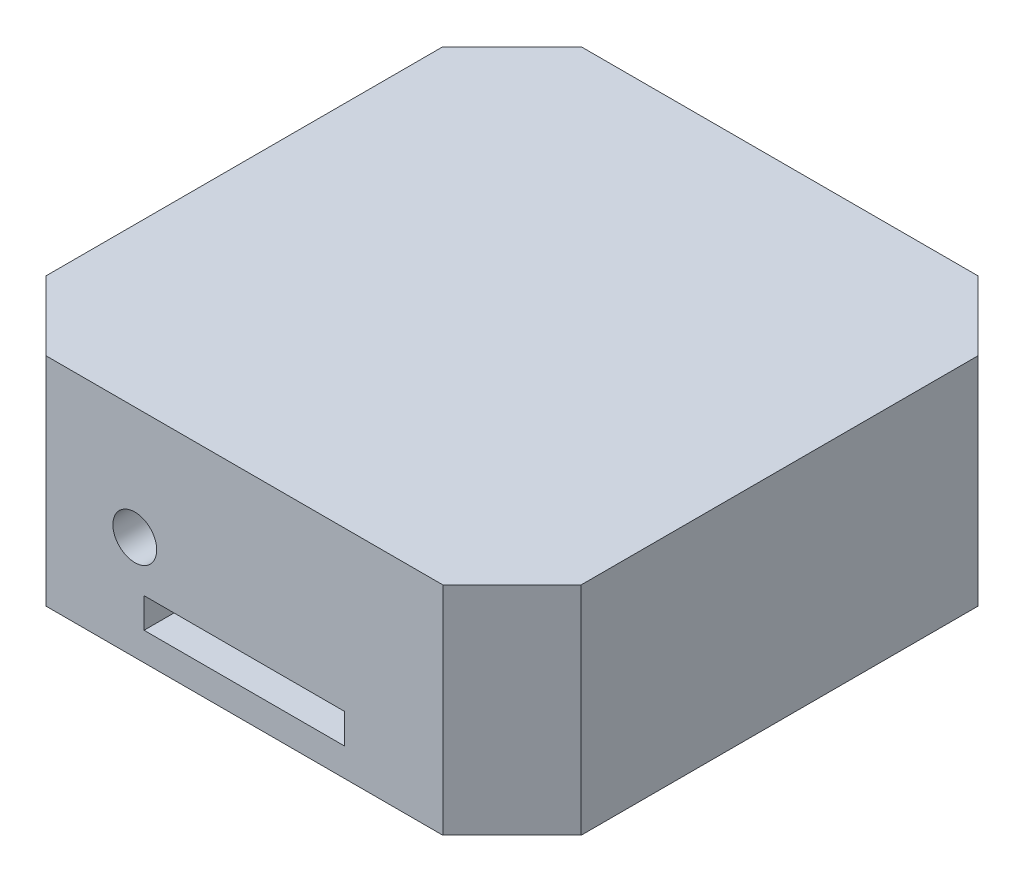
ISO-10303-21;
HEADER;
FILE_DESCRIPTION(('STEP AP214'),'2;1');
FILE_NAME('part.step','',(''),(''),'','','');
FILE_SCHEMA(('AUTOMOTIVE_DESIGN { 1 0 10303 214 1 1 1 1 }'));
ENDSEC;
DATA;
#1=APPLICATION_CONTEXT('core data for automotive mechanical design processes');
#2=APPLICATION_PROTOCOL_DEFINITION('international standard','automotive_design',2000,#1);
#3=PRODUCT_CONTEXT('',#1,'mechanical');
#4=PRODUCT('Part','Part','',(#3));
#5=PRODUCT_RELATED_PRODUCT_CATEGORY('part','',(#4));
#6=PRODUCT_DEFINITION_FORMATION('','',#4);
#7=PRODUCT_DEFINITION_CONTEXT('part definition',#1,'design');
#8=PRODUCT_DEFINITION('design','',#6,#7);
#9=PRODUCT_DEFINITION_SHAPE('','',#8);
#10=(LENGTH_UNIT() NAMED_UNIT(*) SI_UNIT(.MILLI.,.METRE.));
#11=(NAMED_UNIT(*) PLANE_ANGLE_UNIT() SI_UNIT($,.RADIAN.));
#12=(NAMED_UNIT(*) SI_UNIT($,.STERADIAN.) SOLID_ANGLE_UNIT());
#13=UNCERTAINTY_MEASURE_WITH_UNIT(LENGTH_MEASURE(1.E-05),#10,'distance_accuracy_value','');
#14=(GEOMETRIC_REPRESENTATION_CONTEXT(3) GLOBAL_UNCERTAINTY_ASSIGNED_CONTEXT((#13)) GLOBAL_UNIT_ASSIGNED_CONTEXT((#10,
#11,#12)) REPRESENTATION_CONTEXT('',''));
#15=CARTESIAN_POINT('',(0.,0.,0.));
#16=DIRECTION('',(0.,0.,1.));
#17=DIRECTION('',(1.,0.,0.));
#18=AXIS2_PLACEMENT_3D('',#15,#16,#17);
#19=CARTESIAN_POINT('',(-58.,47.,-43.));
#20=DIRECTION('',(0.707106781186547,0.,0.707106781186547));
#21=DIRECTION('',(0.707106781186548,0.,-0.707106781186548));
#22=AXIS2_PLACEMENT_3D('',#19,#20,#21);
#23=PLANE('',#22);
#24=DIRECTION('',(-0.707106781186548,0.,0.707106781186548));
#25=VECTOR('',#24,1.);
#26=CARTESIAN_POINT('',(-58.,0.,-43.));
#27=LINE('',#26,#25);
#28=CARTESIAN_POINT('',(-43.,0.,-58.));
#29=VERTEX_POINT('',#28);
#30=CARTESIAN_POINT('',(-58.,0.,-43.));
#31=VERTEX_POINT('',#30);
#32=EDGE_CURVE('E141',#29,#31,#27,.T.);
#33=ORIENTED_EDGE('',*,*,#32,.T.);
#34=DIRECTION('',(0.,-1.,0.));
#35=VECTOR('',#34,1.);
#36=CARTESIAN_POINT('',(-58.,47.,-43.));
#37=LINE('',#36,#35);
#38=CARTESIAN_POINT('',(-58.,47.,-43.));
#39=VERTEX_POINT('',#38);
#40=EDGE_CURVE('E11',#39,#31,#37,.T.);
#41=ORIENTED_EDGE('',*,*,#40,.F.);
#42=DIRECTION('',(-0.707106781186548,0.,0.707106781186548));
#43=VECTOR('',#42,1.);
#44=CARTESIAN_POINT('',(-58.,47.,-43.));
#45=LINE('',#44,#43);
#46=CARTESIAN_POINT('',(-43.,47.,-58.));
#47=VERTEX_POINT('',#46);
#48=EDGE_CURVE('E157',#47,#39,#45,.T.);
#49=ORIENTED_EDGE('',*,*,#48,.F.);
#50=DIRECTION('',(0.,-1.,0.));
#51=VECTOR('',#50,1.);
#52=CARTESIAN_POINT('',(-43.,47.,-58.));
#53=LINE('',#52,#51);
#54=EDGE_CURVE('E137',#47,#29,#53,.T.);
#55=ORIENTED_EDGE('',*,*,#54,.T.);
#56=EDGE_LOOP('',(#33,#41,#49,#55));
#57=FACE_BOUND('',#56,.T.);
#58=ADVANCED_FACE('F33',(#57),#23,.F.);
#59=CARTESIAN_POINT('',(-58.,47.,43.));
#60=DIRECTION('',(1.,0.,0.));
#61=DIRECTION('',(0.,0.,-1.));
#62=AXIS2_PLACEMENT_3D('',#59,#60,#61);
#63=PLANE('',#62);
#64=DIRECTION('',(0.,0.,1.));
#65=VECTOR('',#64,1.);
#66=CARTESIAN_POINT('',(-58.,0.,43.));
#67=LINE('',#66,#65);
#68=CARTESIAN_POINT('',(-58.,0.,43.));
#69=VERTEX_POINT('',#68);
#70=EDGE_CURVE('E144',#31,#69,#67,.T.);
#71=ORIENTED_EDGE('',*,*,#70,.T.);
#72=DIRECTION('',(0.,-1.,0.));
#73=VECTOR('',#72,1.);
#74=CARTESIAN_POINT('',(-58.,47.,43.));
#75=LINE('',#74,#73);
#76=CARTESIAN_POINT('',(-58.,47.,43.));
#77=VERTEX_POINT('',#76);
#78=EDGE_CURVE('E40',#77,#69,#75,.T.);
#79=ORIENTED_EDGE('',*,*,#78,.F.);
#80=DIRECTION('',(0.,0.,1.));
#81=VECTOR('',#80,1.);
#82=CARTESIAN_POINT('',(-58.,47.,43.));
#83=LINE('',#82,#81);
#84=EDGE_CURVE('E97',#39,#77,#83,.T.);
#85=ORIENTED_EDGE('',*,*,#84,.F.);
#86=ORIENTED_EDGE('',*,*,#40,.T.);
#87=EDGE_LOOP('',(#71,#79,#85,#86));
#88=FACE_BOUND('',#87,.T.);
#89=ADVANCED_FACE('F267',(#88),#63,.F.);
#90=CARTESIAN_POINT('',(-43.,47.,58.));
#91=DIRECTION('',(0.707106781186547,0.,-0.707106781186548));
#92=DIRECTION('',(-0.707106781186548,0.,-0.707106781186547));
#93=AXIS2_PLACEMENT_3D('',#90,#91,#92);
#94=PLANE('',#93);
#95=DIRECTION('',(0.707106781186548,0.,0.707106781186547));
#96=VECTOR('',#95,1.);
#97=CARTESIAN_POINT('',(-43.,0.,58.));
#98=LINE('',#97,#96);
#99=CARTESIAN_POINT('',(-43.,0.,58.));
#100=VERTEX_POINT('',#99);
#101=EDGE_CURVE('E147',#69,#100,#98,.T.);
#102=ORIENTED_EDGE('',*,*,#101,.T.);
#103=DIRECTION('',(0.,-1.,0.));
#104=VECTOR('',#103,1.);
#105=CARTESIAN_POINT('',(-43.,47.,58.));
#106=LINE('',#105,#104);
#107=CARTESIAN_POINT('',(-43.,47.,58.));
#108=VERTEX_POINT('',#107);
#109=EDGE_CURVE('E164',#108,#100,#106,.T.);
#110=ORIENTED_EDGE('',*,*,#109,.F.);
#111=DIRECTION('',(0.707106781186548,0.,0.707106781186547));
#112=VECTOR('',#111,1.);
#113=CARTESIAN_POINT('',(-43.,47.,58.));
#114=LINE('',#113,#112);
#115=EDGE_CURVE('E172',#77,#108,#114,.T.);
#116=ORIENTED_EDGE('',*,*,#115,.F.);
#117=ORIENTED_EDGE('',*,*,#78,.T.);
#118=EDGE_LOOP('',(#102,#110,#116,#117));
#119=FACE_BOUND('',#118,.T.);
#120=ADVANCED_FACE('F170',(#119),#94,.F.);
#121=CARTESIAN_POINT('',(43.,47.,58.));
#122=DIRECTION('',(0.,0.,-1.));
#123=DIRECTION('',(-1.,0.,0.));
#124=AXIS2_PLACEMENT_3D('',#121,#122,#123);
#125=PLANE('',#124);
#126=DIRECTION('',(-1.,0.,0.));
#127=VECTOR('',#126,1.);
#128=CARTESIAN_POINT('',(-21.75,12.6,58.));
#129=LINE('',#128,#127);
#130=CARTESIAN_POINT('',(21.75,12.6,58.));
#131=VERTEX_POINT('',#130);
#132=CARTESIAN_POINT('',(-21.75,12.6,58.));
#133=VERTEX_POINT('',#132);
#134=EDGE_CURVE('E213',#131,#133,#129,.T.);
#135=ORIENTED_EDGE('',*,*,#134,.F.);
#136=DIRECTION('',(0.,1.,0.));
#137=VECTOR('',#136,1.);
#138=CARTESIAN_POINT('',(21.75,12.6,58.));
#139=LINE('',#138,#137);
#140=CARTESIAN_POINT('',(21.75,6.1,58.));
#141=VERTEX_POINT('',#140);
#142=EDGE_CURVE('E47',#141,#131,#139,.T.);
#143=ORIENTED_EDGE('',*,*,#142,.F.);
#144=DIRECTION('',(1.,0.,0.));
#145=VECTOR('',#144,1.);
#146=CARTESIAN_POINT('',(-21.75,6.1,58.));
#147=LINE('',#146,#145);
#148=CARTESIAN_POINT('',(-21.75,6.1,58.));
#149=VERTEX_POINT('',#148);
#150=EDGE_CURVE('E206',#149,#141,#147,.T.);
#151=ORIENTED_EDGE('',*,*,#150,.F.);
#152=DIRECTION('',(0.,-1.,0.));
#153=VECTOR('',#152,1.);
#154=CARTESIAN_POINT('',(-21.75,12.6,58.));
#155=LINE('',#154,#153);
#156=EDGE_CURVE('E210',#133,#149,#155,.T.);
#157=ORIENTED_EDGE('',*,*,#156,.F.);
#158=EDGE_LOOP('',(#135,#143,#151,#157));
#159=FACE_BOUND('',#158,.T.);
#160=CARTESIAN_POINT('',(-23.75,22.55,58.));
#161=DIRECTION('',(0.,0.,1.));
#162=DIRECTION('',(1.,0.,0.));
#163=AXIS2_PLACEMENT_3D('',#160,#161,#162);
#164=CIRCLE('',#163,4.75);
#165=CARTESIAN_POINT('',(-19.,22.55,58.));
#166=VERTEX_POINT('',#165);
#167=EDGE_CURVE('E190',#166,#166,#164,.T.);
#168=ORIENTED_EDGE('',*,*,#167,.F.);
#169=EDGE_LOOP('',(#168));
#170=FACE_BOUND('',#169,.T.);
#171=DIRECTION('',(1.,0.,0.));
#172=VECTOR('',#171,1.);
#173=CARTESIAN_POINT('',(43.,0.,58.));
#174=LINE('',#173,#172);
#175=CARTESIAN_POINT('',(43.,0.,58.));
#176=VERTEX_POINT('',#175);
#177=EDGE_CURVE('E149',#100,#176,#174,.T.);
#178=ORIENTED_EDGE('',*,*,#177,.T.);
#179=DIRECTION('',(0.,-1.,0.));
#180=VECTOR('',#179,1.);
#181=CARTESIAN_POINT('',(43.,47.,58.));
#182=LINE('',#181,#180);
#183=CARTESIAN_POINT('',(43.,47.,58.));
#184=VERTEX_POINT('',#183);
#185=EDGE_CURVE('E161',#184,#176,#182,.T.);
#186=ORIENTED_EDGE('',*,*,#185,.F.);
#187=DIRECTION('',(1.,0.,0.));
#188=VECTOR('',#187,1.);
#189=CARTESIAN_POINT('',(43.,47.,58.));
#190=LINE('',#189,#188);
#191=EDGE_CURVE('E184',#108,#184,#190,.T.);
#192=ORIENTED_EDGE('',*,*,#191,.F.);
#193=ORIENTED_EDGE('',*,*,#109,.T.);
#194=EDGE_LOOP('',(#178,#186,#192,#193));
#195=FACE_BOUND('',#194,.T.);
#196=ADVANCED_FACE('F180',(#159,#170,#195),#125,.F.);
#197=CARTESIAN_POINT('',(58.,47.,43.));
#198=DIRECTION('',(-0.707106781186547,0.,-0.707106781186547));
#199=DIRECTION('',(-0.707106781186548,0.,0.707106781186548));
#200=AXIS2_PLACEMENT_3D('',#197,#198,#199);
#201=PLANE('',#200);
#202=DIRECTION('',(0.707106781186548,0.,-0.707106781186548));
#203=VECTOR('',#202,1.);
#204=CARTESIAN_POINT('',(58.,0.,43.));
#205=LINE('',#204,#203);
#206=CARTESIAN_POINT('',(58.,0.,43.));
#207=VERTEX_POINT('',#206);
#208=EDGE_CURVE('E151',#176,#207,#205,.T.);
#209=ORIENTED_EDGE('',*,*,#208,.T.);
#210=DIRECTION('',(0.,-1.,0.));
#211=VECTOR('',#210,1.);
#212=CARTESIAN_POINT('',(58.,47.,43.));
#213=LINE('',#212,#211);
#214=CARTESIAN_POINT('',(58.,47.,43.));
#215=VERTEX_POINT('',#214);
#216=EDGE_CURVE('E132',#215,#207,#213,.T.);
#217=ORIENTED_EDGE('',*,*,#216,.F.);
#218=DIRECTION('',(0.707106781186548,0.,-0.707106781186548));
#219=VECTOR('',#218,1.);
#220=CARTESIAN_POINT('',(58.,47.,43.));
#221=LINE('',#220,#219);
#222=EDGE_CURVE('E120',#184,#215,#221,.T.);
#223=ORIENTED_EDGE('',*,*,#222,.F.);
#224=ORIENTED_EDGE('',*,*,#185,.T.);
#225=EDGE_LOOP('',(#209,#217,#223,#224));
#226=FACE_BOUND('',#225,.T.);
#227=ADVANCED_FACE('F183',(#226),#201,.F.);
#228=CARTESIAN_POINT('',(58.,47.,-43.));
#229=DIRECTION('',(-1.,0.,0.));
#230=DIRECTION('',(0.,0.,1.));
#231=AXIS2_PLACEMENT_3D('',#228,#229,#230);
#232=PLANE('',#231);
#233=DIRECTION('',(0.,0.,-1.));
#234=VECTOR('',#233,1.);
#235=CARTESIAN_POINT('',(58.,0.,-43.));
#236=LINE('',#235,#234);
#237=CARTESIAN_POINT('',(58.,0.,-43.));
#238=VERTEX_POINT('',#237);
#239=EDGE_CURVE('E129',#207,#238,#236,.T.);
#240=ORIENTED_EDGE('',*,*,#239,.T.);
#241=DIRECTION('',(0.,-1.,0.));
#242=VECTOR('',#241,1.);
#243=CARTESIAN_POINT('',(58.,47.,-43.));
#244=LINE('',#243,#242);
#245=CARTESIAN_POINT('',(58.,47.,-43.));
#246=VERTEX_POINT('',#245);
#247=EDGE_CURVE('E126',#246,#238,#244,.T.);
#248=ORIENTED_EDGE('',*,*,#247,.F.);
#249=DIRECTION('',(0.,0.,-1.));
#250=VECTOR('',#249,1.);
#251=CARTESIAN_POINT('',(58.,47.,-43.));
#252=LINE('',#251,#250);
#253=EDGE_CURVE('E113',#215,#246,#252,.T.);
#254=ORIENTED_EDGE('',*,*,#253,.F.);
#255=ORIENTED_EDGE('',*,*,#216,.T.);
#256=EDGE_LOOP('',(#240,#248,#254,#255));
#257=FACE_BOUND('',#256,.T.);
#258=ADVANCED_FACE('F127',(#257),#232,.F.);
#259=CARTESIAN_POINT('',(43.,47.,-58.));
#260=DIRECTION('',(-0.707106781186548,0.,0.707106781186547));
#261=DIRECTION('',(0.707106781186547,0.,0.707106781186548));
#262=AXIS2_PLACEMENT_3D('',#259,#260,#261);
#263=PLANE('',#262);
#264=DIRECTION('',(-0.707106781186547,0.,-0.707106781186548));
#265=VECTOR('',#264,1.);
#266=CARTESIAN_POINT('',(43.,0.,-58.));
#267=LINE('',#266,#265);
#268=CARTESIAN_POINT('',(43.,0.,-58.));
#269=VERTEX_POINT('',#268);
#270=EDGE_CURVE('E154',#238,#269,#267,.T.);
#271=ORIENTED_EDGE('',*,*,#270,.T.);
#272=DIRECTION('',(0.,-1.,0.));
#273=VECTOR('',#272,1.);
#274=CARTESIAN_POINT('',(43.,47.,-58.));
#275=LINE('',#274,#273);
#276=CARTESIAN_POINT('',(43.,47.,-58.));
#277=VERTEX_POINT('',#276);
#278=EDGE_CURVE('E133',#277,#269,#275,.T.);
#279=ORIENTED_EDGE('',*,*,#278,.F.);
#280=DIRECTION('',(-0.707106781186547,0.,-0.707106781186548));
#281=VECTOR('',#280,1.);
#282=CARTESIAN_POINT('',(43.,47.,-58.));
#283=LINE('',#282,#281);
#284=EDGE_CURVE('E117',#246,#277,#283,.T.);
#285=ORIENTED_EDGE('',*,*,#284,.F.);
#286=ORIENTED_EDGE('',*,*,#247,.T.);
#287=EDGE_LOOP('',(#271,#279,#285,#286));
#288=FACE_BOUND('',#287,.T.);
#289=ADVANCED_FACE('F135',(#288),#263,.F.);
#290=CARTESIAN_POINT('',(-43.,47.,-58.));
#291=DIRECTION('',(0.,0.,1.));
#292=DIRECTION('',(1.,0.,0.));
#293=AXIS2_PLACEMENT_3D('',#290,#291,#292);
#294=PLANE('',#293);
#295=DIRECTION('',(-1.,0.,0.));
#296=VECTOR('',#295,1.);
#297=CARTESIAN_POINT('',(-43.,0.,-58.));
#298=LINE('',#297,#296);
#299=EDGE_CURVE('E89',#269,#29,#298,.T.);
#300=ORIENTED_EDGE('',*,*,#299,.T.);
#301=ORIENTED_EDGE('',*,*,#54,.F.);
#302=DIRECTION('',(-1.,0.,0.));
#303=VECTOR('',#302,1.);
#304=CARTESIAN_POINT('',(-43.,47.,-58.));
#305=LINE('',#304,#303);
#306=EDGE_CURVE('E56',#277,#47,#305,.T.);
#307=ORIENTED_EDGE('',*,*,#306,.F.);
#308=ORIENTED_EDGE('',*,*,#278,.T.);
#309=EDGE_LOOP('',(#300,#301,#307,#308));
#310=FACE_BOUND('',#309,.T.);
#311=ADVANCED_FACE('F274',(#310),#294,.F.);
#312=CARTESIAN_POINT('',(0.,47.,0.));
#313=DIRECTION('',(0.,-1.,0.));
#314=DIRECTION('',(0.,0.,-1.));
#315=AXIS2_PLACEMENT_3D('',#312,#313,#314);
#316=PLANE('',#315);
#317=ORIENTED_EDGE('',*,*,#48,.T.);
#318=ORIENTED_EDGE('',*,*,#84,.T.);
#319=ORIENTED_EDGE('',*,*,#115,.T.);
#320=ORIENTED_EDGE('',*,*,#191,.T.);
#321=ORIENTED_EDGE('',*,*,#222,.T.);
#322=ORIENTED_EDGE('',*,*,#253,.T.);
#323=ORIENTED_EDGE('',*,*,#284,.T.);
#324=ORIENTED_EDGE('',*,*,#306,.T.);
#325=EDGE_LOOP('',(#317,#318,#319,#320,#321,#322,#323,#324));
#326=FACE_BOUND('',#325,.T.);
#327=ADVANCED_FACE('F115',(#326),#316,.F.);
#328=CARTESIAN_POINT('',(0.,0.,0.));
#329=DIRECTION('',(0.,-1.,0.));
#330=DIRECTION('',(0.,0.,-1.));
#331=AXIS2_PLACEMENT_3D('',#328,#329,#330);
#332=PLANE('',#331);
#333=ORIENTED_EDGE('',*,*,#32,.F.);
#334=ORIENTED_EDGE('',*,*,#299,.F.);
#335=ORIENTED_EDGE('',*,*,#270,.F.);
#336=ORIENTED_EDGE('',*,*,#239,.F.);
#337=ORIENTED_EDGE('',*,*,#208,.F.);
#338=ORIENTED_EDGE('',*,*,#177,.F.);
#339=ORIENTED_EDGE('',*,*,#101,.F.);
#340=ORIENTED_EDGE('',*,*,#70,.F.);
#341=EDGE_LOOP('',(#333,#334,#335,#336,#337,#338,#339,#340));
#342=FACE_BOUND('',#341,.T.);
#343=ADVANCED_FACE('F176',(#342),#332,.T.);
#344=CARTESIAN_POINT('',(-23.75,22.55,48.));
#345=DIRECTION('',(0.,0.,1.));
#346=DIRECTION('',(1.,0.,0.));
#347=AXIS2_PLACEMENT_3D('',#344,#345,#346);
#348=CYLINDRICAL_SURFACE('',#347,4.75);
#349=CARTESIAN_POINT('',(-23.75,22.55,48.));
#350=DIRECTION('',(0.,0.,1.));
#351=DIRECTION('',(1.,0.,0.));
#352=AXIS2_PLACEMENT_3D('',#349,#350,#351);
#353=CIRCLE('',#352,4.75);
#354=CARTESIAN_POINT('',(-19.,22.55,48.));
#355=VERTEX_POINT('',#354);
#356=EDGE_CURVE('E193',#355,#355,#353,.T.);
#357=ORIENTED_EDGE('',*,*,#356,.F.);
#358=EDGE_LOOP('',(#357));
#359=FACE_BOUND('',#358,.T.);
#360=ORIENTED_EDGE('',*,*,#167,.T.);
#361=EDGE_LOOP('',(#360));
#362=FACE_BOUND('',#361,.T.);
#363=ADVANCED_FACE('F331',(#359,#362),#348,.F.);
#364=CARTESIAN_POINT('',(-23.75,22.55,48.));
#365=DIRECTION('',(0.,0.,1.));
#366=DIRECTION('',(1.,0.,0.));
#367=AXIS2_PLACEMENT_3D('',#364,#365,#366);
#368=PLANE('',#367);
#369=ORIENTED_EDGE('',*,*,#356,.T.);
#370=EDGE_LOOP('',(#369));
#371=FACE_BOUND('',#370,.T.);
#372=ADVANCED_FACE('F339',(#371),#368,.T.);
#373=CARTESIAN_POINT('',(21.75,12.6,48.));
#374=DIRECTION('',(1.,0.,0.));
#375=DIRECTION('',(0.,0.,-1.));
#376=AXIS2_PLACEMENT_3D('',#373,#374,#375);
#377=PLANE('',#376);
#378=ORIENTED_EDGE('',*,*,#142,.T.);
#379=DIRECTION('',(0.,0.,1.));
#380=VECTOR('',#379,1.);
#381=CARTESIAN_POINT('',(21.75,12.6,48.));
#382=LINE('',#381,#380);
#383=CARTESIAN_POINT('',(21.75,12.6,48.));
#384=VERTEX_POINT('',#383);
#385=EDGE_CURVE('E196',#384,#131,#382,.T.);
#386=ORIENTED_EDGE('',*,*,#385,.F.);
#387=DIRECTION('',(0.,1.,0.));
#388=VECTOR('',#387,1.);
#389=CARTESIAN_POINT('',(21.75,12.6,48.));
#390=LINE('',#389,#388);
#391=CARTESIAN_POINT('',(21.75,6.1,48.));
#392=VERTEX_POINT('',#391);
#393=EDGE_CURVE('E209',#392,#384,#390,.T.);
#394=ORIENTED_EDGE('',*,*,#393,.F.);
#395=DIRECTION('',(0.,0.,1.));
#396=VECTOR('',#395,1.);
#397=CARTESIAN_POINT('',(21.75,6.1,48.));
#398=LINE('',#397,#396);
#399=EDGE_CURVE('E145',#392,#141,#398,.T.);
#400=ORIENTED_EDGE('',*,*,#399,.T.);
#401=EDGE_LOOP('',(#378,#386,#394,#400));
#402=FACE_BOUND('',#401,.T.);
#403=ADVANCED_FACE('F234',(#402),#377,.F.);
#404=CARTESIAN_POINT('',(-21.75,6.1,48.));
#405=DIRECTION('',(0.,-1.,0.));
#406=DIRECTION('',(0.,0.,-1.));
#407=AXIS2_PLACEMENT_3D('',#404,#405,#406);
#408=PLANE('',#407);
#409=ORIENTED_EDGE('',*,*,#150,.T.);
#410=ORIENTED_EDGE('',*,*,#399,.F.);
#411=DIRECTION('',(1.,0.,0.));
#412=VECTOR('',#411,1.);
#413=CARTESIAN_POINT('',(-21.75,6.1,48.));
#414=LINE('',#413,#412);
#415=CARTESIAN_POINT('',(-21.75,6.1,48.));
#416=VERTEX_POINT('',#415);
#417=EDGE_CURVE('E199',#416,#392,#414,.T.);
#418=ORIENTED_EDGE('',*,*,#417,.F.);
#419=DIRECTION('',(0.,0.,1.));
#420=VECTOR('',#419,1.);
#421=CARTESIAN_POINT('',(-21.75,6.1,48.));
#422=LINE('',#421,#420);
#423=EDGE_CURVE('E202',#416,#149,#422,.T.);
#424=ORIENTED_EDGE('',*,*,#423,.T.);
#425=EDGE_LOOP('',(#409,#410,#418,#424));
#426=FACE_BOUND('',#425,.T.);
#427=ADVANCED_FACE('F245',(#426),#408,.F.);
#428=CARTESIAN_POINT('',(-21.75,12.6,48.));
#429=DIRECTION('',(-1.,0.,0.));
#430=DIRECTION('',(0.,0.,1.));
#431=AXIS2_PLACEMENT_3D('',#428,#429,#430);
#432=PLANE('',#431);
#433=ORIENTED_EDGE('',*,*,#156,.T.);
#434=ORIENTED_EDGE('',*,*,#423,.F.);
#435=DIRECTION('',(0.,-1.,0.));
#436=VECTOR('',#435,1.);
#437=CARTESIAN_POINT('',(-21.75,12.6,48.));
#438=LINE('',#437,#436);
#439=CARTESIAN_POINT('',(-21.75,12.6,48.));
#440=VERTEX_POINT('',#439);
#441=EDGE_CURVE('E219',#440,#416,#438,.T.);
#442=ORIENTED_EDGE('',*,*,#441,.F.);
#443=DIRECTION('',(0.,0.,1.));
#444=VECTOR('',#443,1.);
#445=CARTESIAN_POINT('',(-21.75,12.6,48.));
#446=LINE('',#445,#444);
#447=EDGE_CURVE('E198',#440,#133,#446,.T.);
#448=ORIENTED_EDGE('',*,*,#447,.T.);
#449=EDGE_LOOP('',(#433,#434,#442,#448));
#450=FACE_BOUND('',#449,.T.);
#451=ADVANCED_FACE('F250',(#450),#432,.F.);
#452=CARTESIAN_POINT('',(-21.75,12.6,48.));
#453=DIRECTION('',(0.,1.,0.));
#454=DIRECTION('',(0.,0.,1.));
#455=AXIS2_PLACEMENT_3D('',#452,#453,#454);
#456=PLANE('',#455);
#457=ORIENTED_EDGE('',*,*,#134,.T.);
#458=ORIENTED_EDGE('',*,*,#447,.F.);
#459=DIRECTION('',(-1.,0.,0.));
#460=VECTOR('',#459,1.);
#461=CARTESIAN_POINT('',(-21.75,12.6,48.));
#462=LINE('',#461,#460);
#463=EDGE_CURVE('E222',#384,#440,#462,.T.);
#464=ORIENTED_EDGE('',*,*,#463,.F.);
#465=ORIENTED_EDGE('',*,*,#385,.T.);
#466=EDGE_LOOP('',(#457,#458,#464,#465));
#467=FACE_BOUND('',#466,.T.);
#468=ADVANCED_FACE('F256',(#467),#456,.F.);
#469=CARTESIAN_POINT('',(0.,0.,48.));
#470=DIRECTION('',(0.,0.,1.));
#471=DIRECTION('',(1.,0.,0.));
#472=AXIS2_PLACEMENT_3D('',#469,#470,#471);
#473=PLANE('',#472);
#474=ORIENTED_EDGE('',*,*,#393,.T.);
#475=ORIENTED_EDGE('',*,*,#463,.T.);
#476=ORIENTED_EDGE('',*,*,#441,.T.);
#477=ORIENTED_EDGE('',*,*,#417,.T.);
#478=EDGE_LOOP('',(#474,#475,#476,#477));
#479=FACE_BOUND('',#478,.T.);
#480=ADVANCED_FACE('F229',(#479),#473,.T.);
#481=CLOSED_SHELL('',(#58,#89,#120,#196,#227,#258,#289,#311,#327,#343,#363,#372,#403,#427,#451,
#468,#480));
#482=MANIFOLD_SOLID_BREP('B2',#481);
#483=ADVANCED_BREP_SHAPE_REPRESENTATION('',(#18,#482),#14);
#484=SHAPE_DEFINITION_REPRESENTATION(#9,#483);
ENDSEC;
END-ISO-10303-21;
